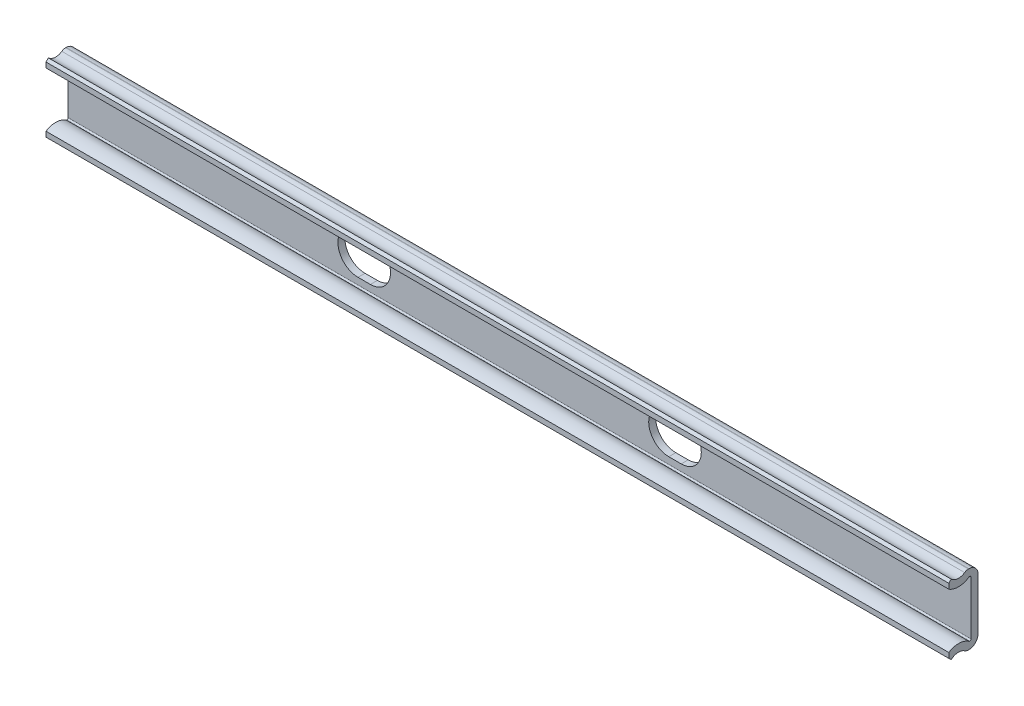
ISO-10303-21;
HEADER;
FILE_DESCRIPTION(('STEP AP214'),'2;1');
FILE_NAME('part.step','',(''),(''),'','','');
FILE_SCHEMA(('AUTOMOTIVE_DESIGN { 1 0 10303 214 1 1 1 1 }'));
ENDSEC;
DATA;
#1=APPLICATION_CONTEXT('core data for automotive mechanical design processes');
#2=APPLICATION_PROTOCOL_DEFINITION('international standard','automotive_design',2000,#1);
#3=PRODUCT_CONTEXT('',#1,'mechanical');
#4=PRODUCT('Part','Part','',(#3));
#5=PRODUCT_RELATED_PRODUCT_CATEGORY('part','',(#4));
#6=PRODUCT_DEFINITION_FORMATION('','',#4);
#7=PRODUCT_DEFINITION_CONTEXT('part definition',#1,'design');
#8=PRODUCT_DEFINITION('design','',#6,#7);
#9=PRODUCT_DEFINITION_SHAPE('','',#8);
#10=(LENGTH_UNIT() NAMED_UNIT(*) SI_UNIT(.MILLI.,.METRE.));
#11=(NAMED_UNIT(*) PLANE_ANGLE_UNIT() SI_UNIT($,.RADIAN.));
#12=(NAMED_UNIT(*) SI_UNIT($,.STERADIAN.) SOLID_ANGLE_UNIT());
#13=UNCERTAINTY_MEASURE_WITH_UNIT(LENGTH_MEASURE(1.E-05),#10,'distance_accuracy_value','');
#14=(GEOMETRIC_REPRESENTATION_CONTEXT(3) GLOBAL_UNCERTAINTY_ASSIGNED_CONTEXT((#13)) GLOBAL_UNIT_ASSIGNED_CONTEXT((#10,
#11,#12)) REPRESENTATION_CONTEXT('',''));
#15=CARTESIAN_POINT('',(0.,0.,0.));
#16=DIRECTION('',(0.,0.,1.));
#17=DIRECTION('',(1.,0.,0.));
#18=AXIS2_PLACEMENT_3D('',#15,#16,#17);
#19=CARTESIAN_POINT('',(200.,-6.06775074399303,-3.08));
#20=DIRECTION('',(0.,0.,-1.));
#21=DIRECTION('',(-1.,0.,0.));
#22=AXIS2_PLACEMENT_3D('',#19,#20,#21);
#23=PLANE('',#22);
#24=DIRECTION('',(0.,-1.,0.));
#25=VECTOR('',#24,1.);
#26=CARTESIAN_POINT('',(0.,-6.06775074399303,-3.08));
#27=LINE('',#26,#25);
#28=CARTESIAN_POINT('',(0.,-6.06775074399303,-3.08));
#29=VERTEX_POINT('',#28);
#30=CARTESIAN_POINT('',(0.,-7.21,-3.08));
#31=VERTEX_POINT('',#30);
#32=EDGE_CURVE('E266',#29,#31,#27,.T.);
#33=ORIENTED_EDGE('',*,*,#32,.T.);
#34=DIRECTION('',(-1.,0.,0.));
#35=VECTOR('',#34,1.);
#36=CARTESIAN_POINT('',(200.,-7.21,-3.08));
#37=LINE('',#36,#35);
#38=CARTESIAN_POINT('',(200.,-7.21,-3.08));
#39=VERTEX_POINT('',#38);
#40=EDGE_CURVE('E11',#39,#31,#37,.T.);
#41=ORIENTED_EDGE('',*,*,#40,.F.);
#42=DIRECTION('',(0.,-1.,0.));
#43=VECTOR('',#42,1.);
#44=CARTESIAN_POINT('',(200.,-6.06775074399303,-3.08));
#45=LINE('',#44,#43);
#46=CARTESIAN_POINT('',(200.,-6.06775074399303,-3.08));
#47=VERTEX_POINT('',#46);
#48=EDGE_CURVE('E267',#47,#39,#45,.T.);
#49=ORIENTED_EDGE('',*,*,#48,.F.);
#50=DIRECTION('',(-1.,0.,0.));
#51=VECTOR('',#50,1.);
#52=CARTESIAN_POINT('',(200.,-6.06775074399303,-3.08));
#53=LINE('',#52,#51);
#54=EDGE_CURVE('E313',#47,#29,#53,.T.);
#55=ORIENTED_EDGE('',*,*,#54,.T.);
#56=EDGE_LOOP('',(#33,#41,#49,#55));
#57=FACE_BOUND('',#56,.T.);
#58=ADVANCED_FACE('F17',(#57),#23,.F.);
#59=CARTESIAN_POINT('',(200.,-7.21,-3.08));
#60=DIRECTION('',(0.,0.70710678118655,-0.707106781186545));
#61=DIRECTION('',(0.,0.707106781186545,0.70710678118655));
#62=AXIS2_PLACEMENT_3D('',#59,#60,#61);
#63=PLANE('',#62);
#64=DIRECTION('',(0.,-0.707106781186545,-0.70710678118655));
#65=VECTOR('',#64,1.);
#66=CARTESIAN_POINT('',(0.,-7.21,-3.08));
#67=LINE('',#66,#65);
#68=CARTESIAN_POINT('',(0.,-7.73782878398184,-3.60782878398185));
#69=VERTEX_POINT('',#68);
#70=EDGE_CURVE('E316',#31,#69,#67,.T.);
#71=ORIENTED_EDGE('',*,*,#70,.T.);
#72=DIRECTION('',(-1.,0.,0.));
#73=VECTOR('',#72,1.);
#74=CARTESIAN_POINT('',(200.,-7.73782878398184,-3.60782878398185));
#75=LINE('',#74,#73);
#76=CARTESIAN_POINT('',(200.,-7.73782878398184,-3.60782878398185));
#77=VERTEX_POINT('',#76);
#78=EDGE_CURVE('E24',#77,#69,#75,.T.);
#79=ORIENTED_EDGE('',*,*,#78,.F.);
#80=DIRECTION('',(0.,-0.707106781186545,-0.70710678118655));
#81=VECTOR('',#80,1.);
#82=CARTESIAN_POINT('',(200.,-7.21,-3.08));
#83=LINE('',#82,#81);
#84=EDGE_CURVE('E270',#39,#77,#83,.T.);
#85=ORIENTED_EDGE('',*,*,#84,.F.);
#86=ORIENTED_EDGE('',*,*,#40,.T.);
#87=EDGE_LOOP('',(#71,#79,#85,#86));
#88=FACE_BOUND('',#87,.T.);
#89=ADVANCED_FACE('F412',(#88),#63,.F.);
#90=CARTESIAN_POINT('',(200.,-9.47,-5.24));
#91=DIRECTION('',(-1.,0.,0.));
#92=DIRECTION('',(0.,0.,1.));
#93=AXIS2_PLACEMENT_3D('',#90,#91,#92);
#94=CYLINDRICAL_SURFACE('',#93,2.38);
#95=CARTESIAN_POINT('',(0.,-9.47,-5.24));
#96=DIRECTION('',(1.,0.,0.));
#97=DIRECTION('',(0.,0.,-1.));
#98=AXIS2_PLACEMENT_3D('',#95,#96,#97);
#99=CIRCLE('',#98,2.38);
#100=CARTESIAN_POINT('',(0.,-7.50711340206186,-6.58591091965063));
#101=VERTEX_POINT('',#100);
#102=EDGE_CURVE('E319',#101,#69,#99,.T.);
#103=ORIENTED_EDGE('',*,*,#102,.F.);
#104=DIRECTION('',(-1.,0.,0.));
#105=VECTOR('',#104,1.);
#106=CARTESIAN_POINT('',(200.,-7.50711340206186,-6.58591091965063));
#107=LINE('',#106,#105);
#108=CARTESIAN_POINT('',(200.,-7.50711340206186,-6.58591091965063));
#109=VERTEX_POINT('',#108);
#110=EDGE_CURVE('E405',#109,#101,#107,.T.);
#111=ORIENTED_EDGE('',*,*,#110,.F.);
#112=CARTESIAN_POINT('',(200.,-9.47,-5.24));
#113=DIRECTION('',(1.,0.,0.));
#114=DIRECTION('',(0.,0.,-1.));
#115=AXIS2_PLACEMENT_3D('',#112,#113,#114);
#116=CIRCLE('',#115,2.38);
#117=EDGE_CURVE('E273',#109,#77,#116,.T.);
#118=ORIENTED_EDGE('',*,*,#117,.T.);
#119=ORIENTED_EDGE('',*,*,#78,.T.);
#120=EDGE_LOOP('',(#103,#111,#118,#119));
#121=FACE_BOUND('',#120,.T.);
#122=ADVANCED_FACE('F409',(#121),#94,.F.);
#123=CARTESIAN_POINT('',(200.,-6.26999999999999,-7.4341741043044));
#124=DIRECTION('',(-1.,0.,0.));
#125=DIRECTION('',(0.,0.,1.));
#126=AXIS2_PLACEMENT_3D('',#123,#124,#125);
#127=CYLINDRICAL_SURFACE('',#126,1.50000000000001);
#128=CARTESIAN_POINT('',(0.,-6.26999999999999,-7.4341741043044));
#129=DIRECTION('',(1.,0.,0.));
#130=DIRECTION('',(0.,0.,-1.));
#131=AXIS2_PLACEMENT_3D('',#128,#129,#130);
#132=CIRCLE('',#131,1.50000000000001);
#133=CARTESIAN_POINT('',(0.,-7.77,-7.4341741043044));
#134=VERTEX_POINT('',#133);
#135=EDGE_CURVE('E322',#101,#134,#132,.T.);
#136=ORIENTED_EDGE('',*,*,#135,.T.);
#137=DIRECTION('',(-1.,0.,0.));
#138=VECTOR('',#137,1.);
#139=CARTESIAN_POINT('',(200.,-7.77,-7.4341741043044));
#140=LINE('',#139,#138);
#141=CARTESIAN_POINT('',(200.,-7.77,-7.4341741043044));
#142=VERTEX_POINT('',#141);
#143=EDGE_CURVE('E402',#142,#134,#140,.T.);
#144=ORIENTED_EDGE('',*,*,#143,.F.);
#145=CARTESIAN_POINT('',(200.,-6.26999999999999,-7.4341741043044));
#146=DIRECTION('',(1.,0.,0.));
#147=DIRECTION('',(0.,0.,-1.));
#148=AXIS2_PLACEMENT_3D('',#145,#146,#147);
#149=CIRCLE('',#148,1.50000000000001);
#150=EDGE_CURVE('E276',#109,#142,#149,.T.);
#151=ORIENTED_EDGE('',*,*,#150,.F.);
#152=ORIENTED_EDGE('',*,*,#110,.T.);
#153=EDGE_LOOP('',(#136,#144,#151,#152));
#154=FACE_BOUND('',#153,.T.);
#155=ADVANCED_FACE('F422',(#154),#127,.T.);
#156=CARTESIAN_POINT('',(200.,-7.77,-7.43417410430439));
#157=DIRECTION('',(0.,1.,0.));
#158=DIRECTION('',(0.,0.,1.));
#159=AXIS2_PLACEMENT_3D('',#156,#157,#158);
#160=PLANE('',#159);
#161=DIRECTION('',(0.,0.,-1.));
#162=VECTOR('',#161,1.);
#163=CARTESIAN_POINT('',(0.,-7.77,-7.43417410430439));
#164=LINE('',#163,#162);
#165=CARTESIAN_POINT('',(0.,-7.77,-7.55));
#166=VERTEX_POINT('',#165);
#167=EDGE_CURVE('E324',#134,#166,#164,.T.);
#168=ORIENTED_EDGE('',*,*,#167,.T.);
#169=DIRECTION('',(-1.,0.,0.));
#170=VECTOR('',#169,1.);
#171=CARTESIAN_POINT('',(200.,-7.77,-7.55));
#172=LINE('',#171,#170);
#173=CARTESIAN_POINT('',(200.,-7.77,-7.55));
#174=VERTEX_POINT('',#173);
#175=EDGE_CURVE('E399',#174,#166,#172,.T.);
#176=ORIENTED_EDGE('',*,*,#175,.F.);
#177=DIRECTION('',(0.,0.,-1.));
#178=VECTOR('',#177,1.);
#179=CARTESIAN_POINT('',(200.,-7.77,-7.43417410430439));
#180=LINE('',#179,#178);
#181=EDGE_CURVE('E278',#142,#174,#180,.T.);
#182=ORIENTED_EDGE('',*,*,#181,.F.);
#183=ORIENTED_EDGE('',*,*,#143,.T.);
#184=EDGE_LOOP('',(#168,#176,#182,#183));
#185=FACE_BOUND('',#184,.T.);
#186=ADVANCED_FACE('F426',(#185),#160,.F.);
#187=CARTESIAN_POINT('',(200.,-5.77,-7.55));
#188=DIRECTION('',(-1.,0.,0.));
#189=DIRECTION('',(0.,0.,1.));
#190=AXIS2_PLACEMENT_3D('',#187,#188,#189);
#191=CYLINDRICAL_SURFACE('',#190,2.);
#192=CARTESIAN_POINT('',(0.,-5.77,-7.55));
#193=DIRECTION('',(1.,0.,0.));
#194=DIRECTION('',(0.,0.,-1.));
#195=AXIS2_PLACEMENT_3D('',#192,#193,#194);
#196=CIRCLE('',#195,2.);
#197=CARTESIAN_POINT('',(0.,-5.77,-9.55));
#198=VERTEX_POINT('',#197);
#199=EDGE_CURVE('E326',#166,#198,#196,.T.);
#200=ORIENTED_EDGE('',*,*,#199,.T.);
#201=DIRECTION('',(-1.,0.,0.));
#202=VECTOR('',#201,1.);
#203=CARTESIAN_POINT('',(200.,-5.77,-9.55));
#204=LINE('',#203,#202);
#205=CARTESIAN_POINT('',(200.,-5.77,-9.55));
#206=VERTEX_POINT('',#205);
#207=EDGE_CURVE('E396',#206,#198,#204,.T.);
#208=ORIENTED_EDGE('',*,*,#207,.F.);
#209=CARTESIAN_POINT('',(200.,-5.77,-7.55));
#210=DIRECTION('',(1.,0.,0.));
#211=DIRECTION('',(0.,0.,-1.));
#212=AXIS2_PLACEMENT_3D('',#209,#210,#211);
#213=CIRCLE('',#212,2.);
#214=EDGE_CURVE('E280',#174,#206,#213,.T.);
#215=ORIENTED_EDGE('',*,*,#214,.F.);
#216=ORIENTED_EDGE('',*,*,#175,.T.);
#217=EDGE_LOOP('',(#200,#208,#215,#216));
#218=FACE_BOUND('',#217,.T.);
#219=ADVANCED_FACE('F501',(#218),#191,.T.);
#220=CARTESIAN_POINT('',(200.,-5.77,-9.55));
#221=DIRECTION('',(0.,0.,1.));
#222=DIRECTION('',(1.,0.,0.));
#223=AXIS2_PLACEMENT_3D('',#220,#221,#222);
#224=PLANE('',#223);
#225=DIRECTION('',(1.,0.,0.));
#226=VECTOR('',#225,1.);
#227=CARTESIAN_POINT('',(200.,4.45,-9.55));
#228=LINE('',#227,#226);
#229=CARTESIAN_POINT('',(133.05,4.45,-9.55));
#230=VERTEX_POINT('',#229);
#231=CARTESIAN_POINT('',(135.8,4.45,-9.55));
#232=VERTEX_POINT('',#231);
#233=EDGE_CURVE('E235',#230,#232,#228,.T.);
#234=ORIENTED_EDGE('',*,*,#233,.F.);
#235=CARTESIAN_POINT('',(133.05,0.,-9.55));
#236=DIRECTION('',(0.,0.,1.));
#237=DIRECTION('',(1.,0.,0.));
#238=AXIS2_PLACEMENT_3D('',#235,#236,#237);
#239=CIRCLE('',#238,4.45);
#240=CARTESIAN_POINT('',(133.05,-4.45,-9.55));
#241=VERTEX_POINT('',#240);
#242=EDGE_CURVE('E215',#241,#230,#239,.F.);
#243=ORIENTED_EDGE('',*,*,#242,.F.);
#244=DIRECTION('',(-1.,0.,0.));
#245=VECTOR('',#244,1.);
#246=CARTESIAN_POINT('',(200.,-4.45,-9.55));
#247=LINE('',#246,#245);
#248=CARTESIAN_POINT('',(135.8,-4.45,-9.55));
#249=VERTEX_POINT('',#248);
#250=EDGE_CURVE('E232',#249,#241,#247,.T.);
#251=ORIENTED_EDGE('',*,*,#250,.F.);
#252=CARTESIAN_POINT('',(135.8,0.,-9.55));
#253=DIRECTION('',(0.,0.,1.));
#254=DIRECTION('',(1.,0.,0.));
#255=AXIS2_PLACEMENT_3D('',#252,#253,#254);
#256=CIRCLE('',#255,4.45);
#257=EDGE_CURVE('E216',#232,#249,#256,.F.);
#258=ORIENTED_EDGE('',*,*,#257,.F.);
#259=EDGE_LOOP('',(#234,#243,#251,#258));
#260=FACE_BOUND('',#259,.T.);
#261=DIRECTION('',(1.,0.,0.));
#262=VECTOR('',#261,1.);
#263=CARTESIAN_POINT('',(200.,4.45,-9.55));
#264=LINE('',#263,#262);
#265=CARTESIAN_POINT('',(64.2,4.45,-9.55));
#266=VERTEX_POINT('',#265);
#267=CARTESIAN_POINT('',(66.95,4.45,-9.55));
#268=VERTEX_POINT('',#267);
#269=EDGE_CURVE('E263',#266,#268,#264,.T.);
#270=ORIENTED_EDGE('',*,*,#269,.F.);
#271=CARTESIAN_POINT('',(64.2,0.,-9.55));
#272=DIRECTION('',(0.,0.,1.));
#273=DIRECTION('',(1.,0.,0.));
#274=AXIS2_PLACEMENT_3D('',#271,#272,#273);
#275=CIRCLE('',#274,4.45);
#276=CARTESIAN_POINT('',(64.2,-4.45,-9.55));
#277=VERTEX_POINT('',#276);
#278=EDGE_CURVE('E261',#277,#266,#275,.F.);
#279=ORIENTED_EDGE('',*,*,#278,.F.);
#280=DIRECTION('',(-1.,0.,0.));
#281=VECTOR('',#280,1.);
#282=CARTESIAN_POINT('',(200.,-4.45,-9.55));
#283=LINE('',#282,#281);
#284=CARTESIAN_POINT('',(66.95,-4.45,-9.55));
#285=VERTEX_POINT('',#284);
#286=EDGE_CURVE('E259',#285,#277,#283,.T.);
#287=ORIENTED_EDGE('',*,*,#286,.F.);
#288=CARTESIAN_POINT('',(66.95,0.,-9.55));
#289=DIRECTION('',(0.,0.,1.));
#290=DIRECTION('',(1.,0.,0.));
#291=AXIS2_PLACEMENT_3D('',#288,#289,#290);
#292=CIRCLE('',#291,4.45);
#293=EDGE_CURVE('E257',#268,#285,#292,.F.);
#294=ORIENTED_EDGE('',*,*,#293,.F.);
#295=EDGE_LOOP('',(#270,#279,#287,#294));
#296=FACE_BOUND('',#295,.T.);
#297=DIRECTION('',(0.,1.,0.));
#298=VECTOR('',#297,1.);
#299=CARTESIAN_POINT('',(0.,-5.77,-9.55));
#300=LINE('',#299,#298);
#301=CARTESIAN_POINT('',(0.,5.77,-9.55));
#302=VERTEX_POINT('',#301);
#303=EDGE_CURVE('E328',#198,#302,#300,.T.);
#304=ORIENTED_EDGE('',*,*,#303,.T.);
#305=DIRECTION('',(-1.,0.,0.));
#306=VECTOR('',#305,1.);
#307=CARTESIAN_POINT('',(200.,5.77,-9.55));
#308=LINE('',#307,#306);
#309=CARTESIAN_POINT('',(200.,5.77,-9.55));
#310=VERTEX_POINT('',#309);
#311=EDGE_CURVE('E393',#310,#302,#308,.T.);
#312=ORIENTED_EDGE('',*,*,#311,.F.);
#313=DIRECTION('',(0.,1.,0.));
#314=VECTOR('',#313,1.);
#315=CARTESIAN_POINT('',(200.,-5.77,-9.55));
#316=LINE('',#315,#314);
#317=EDGE_CURVE('E282',#206,#310,#316,.T.);
#318=ORIENTED_EDGE('',*,*,#317,.F.);
#319=ORIENTED_EDGE('',*,*,#207,.T.);
#320=EDGE_LOOP('',(#304,#312,#318,#319));
#321=FACE_BOUND('',#320,.T.);
#322=ADVANCED_FACE('F499',(#260,#296,#321),#224,.F.);
#323=CARTESIAN_POINT('',(200.,5.77,-7.55));
#324=DIRECTION('',(-1.,0.,0.));
#325=DIRECTION('',(0.,0.,1.));
#326=AXIS2_PLACEMENT_3D('',#323,#324,#325);
#327=CYLINDRICAL_SURFACE('',#326,2.);
#328=CARTESIAN_POINT('',(0.,5.77,-7.55));
#329=DIRECTION('',(1.,0.,0.));
#330=DIRECTION('',(0.,0.,-1.));
#331=AXIS2_PLACEMENT_3D('',#328,#329,#330);
#332=CIRCLE('',#331,2.);
#333=CARTESIAN_POINT('',(0.,7.77,-7.55));
#334=VERTEX_POINT('',#333);
#335=EDGE_CURVE('E330',#302,#334,#332,.T.);
#336=ORIENTED_EDGE('',*,*,#335,.T.);
#337=DIRECTION('',(-1.,0.,0.));
#338=VECTOR('',#337,1.);
#339=CARTESIAN_POINT('',(200.,7.77,-7.55));
#340=LINE('',#339,#338);
#341=CARTESIAN_POINT('',(200.,7.77,-7.55));
#342=VERTEX_POINT('',#341);
#343=EDGE_CURVE('E390',#342,#334,#340,.T.);
#344=ORIENTED_EDGE('',*,*,#343,.F.);
#345=CARTESIAN_POINT('',(200.,5.77,-7.55));
#346=DIRECTION('',(1.,0.,0.));
#347=DIRECTION('',(0.,0.,-1.));
#348=AXIS2_PLACEMENT_3D('',#345,#346,#347);
#349=CIRCLE('',#348,2.);
#350=EDGE_CURVE('E284',#310,#342,#349,.T.);
#351=ORIENTED_EDGE('',*,*,#350,.F.);
#352=ORIENTED_EDGE('',*,*,#311,.T.);
#353=EDGE_LOOP('',(#336,#344,#351,#352));
#354=FACE_BOUND('',#353,.T.);
#355=ADVANCED_FACE('F495',(#354),#327,.T.);
#356=CARTESIAN_POINT('',(200.,7.77,-7.55));
#357=DIRECTION('',(0.,-1.,0.));
#358=DIRECTION('',(0.,0.,-1.));
#359=AXIS2_PLACEMENT_3D('',#356,#357,#358);
#360=PLANE('',#359);
#361=DIRECTION('',(0.,0.,1.));
#362=VECTOR('',#361,1.);
#363=CARTESIAN_POINT('',(0.,7.77,-7.55));
#364=LINE('',#363,#362);
#365=CARTESIAN_POINT('',(0.,7.77,-7.43417410430439));
#366=VERTEX_POINT('',#365);
#367=EDGE_CURVE('E332',#334,#366,#364,.T.);
#368=ORIENTED_EDGE('',*,*,#367,.T.);
#369=DIRECTION('',(-1.,0.,0.));
#370=VECTOR('',#369,1.);
#371=CARTESIAN_POINT('',(200.,7.77,-7.43417410430439));
#372=LINE('',#371,#370);
#373=CARTESIAN_POINT('',(200.,7.77,-7.43417410430439));
#374=VERTEX_POINT('',#373);
#375=EDGE_CURVE('E387',#374,#366,#372,.T.);
#376=ORIENTED_EDGE('',*,*,#375,.F.);
#377=DIRECTION('',(0.,0.,1.));
#378=VECTOR('',#377,1.);
#379=CARTESIAN_POINT('',(200.,7.77,-7.55));
#380=LINE('',#379,#378);
#381=EDGE_CURVE('E286',#342,#374,#380,.T.);
#382=ORIENTED_EDGE('',*,*,#381,.F.);
#383=ORIENTED_EDGE('',*,*,#343,.T.);
#384=EDGE_LOOP('',(#368,#376,#382,#383));
#385=FACE_BOUND('',#384,.T.);
#386=ADVANCED_FACE('F490',(#385),#360,.F.);
#387=CARTESIAN_POINT('',(200.,6.26999999999998,-7.4341741043044));
#388=DIRECTION('',(-1.,0.,0.));
#389=DIRECTION('',(0.,0.,1.));
#390=AXIS2_PLACEMENT_3D('',#387,#388,#389);
#391=CYLINDRICAL_SURFACE('',#390,1.50000000000002);
#392=CARTESIAN_POINT('',(0.,6.26999999999998,-7.4341741043044));
#393=DIRECTION('',(1.,0.,0.));
#394=DIRECTION('',(0.,0.,-1.));
#395=AXIS2_PLACEMENT_3D('',#392,#393,#394);
#396=CIRCLE('',#395,1.50000000000002);
#397=CARTESIAN_POINT('',(0.,7.50711340206186,-6.58591091965063));
#398=VERTEX_POINT('',#397);
#399=EDGE_CURVE('E334',#366,#398,#396,.T.);
#400=ORIENTED_EDGE('',*,*,#399,.T.);
#401=DIRECTION('',(-1.,0.,0.));
#402=VECTOR('',#401,1.);
#403=CARTESIAN_POINT('',(200.,7.50711340206186,-6.58591091965063));
#404=LINE('',#403,#402);
#405=CARTESIAN_POINT('',(200.,7.50711340206186,-6.58591091965063));
#406=VERTEX_POINT('',#405);
#407=EDGE_CURVE('E385',#406,#398,#404,.T.);
#408=ORIENTED_EDGE('',*,*,#407,.F.);
#409=CARTESIAN_POINT('',(200.,6.26999999999998,-7.4341741043044));
#410=DIRECTION('',(1.,0.,0.));
#411=DIRECTION('',(0.,0.,-1.));
#412=AXIS2_PLACEMENT_3D('',#409,#410,#411);
#413=CIRCLE('',#412,1.50000000000002);
#414=EDGE_CURVE('E288',#374,#406,#413,.T.);
#415=ORIENTED_EDGE('',*,*,#414,.F.);
#416=ORIENTED_EDGE('',*,*,#375,.T.);
#417=EDGE_LOOP('',(#400,#408,#415,#416));
#418=FACE_BOUND('',#417,.T.);
#419=ADVANCED_FACE('F484',(#418),#391,.T.);
#420=CARTESIAN_POINT('',(200.,9.46999999999999,-5.24));
#421=DIRECTION('',(-1.,0.,0.));
#422=DIRECTION('',(0.,0.,1.));
#423=AXIS2_PLACEMENT_3D('',#420,#421,#422);
#424=CYLINDRICAL_SURFACE('',#423,2.37999999999999);
#425=CARTESIAN_POINT('',(0.,9.46999999999999,-5.24));
#426=DIRECTION('',(1.,0.,0.));
#427=DIRECTION('',(0.,0.,-1.));
#428=AXIS2_PLACEMENT_3D('',#425,#426,#427);
#429=CIRCLE('',#428,2.37999999999999);
#430=CARTESIAN_POINT('',(0.,7.73782878398184,-3.60782878398185));
#431=VERTEX_POINT('',#430);
#432=EDGE_CURVE('E337',#431,#398,#429,.T.);
#433=ORIENTED_EDGE('',*,*,#432,.F.);
#434=DIRECTION('',(-1.,0.,0.));
#435=VECTOR('',#434,1.);
#436=CARTESIAN_POINT('',(200.,7.73782878398184,-3.60782878398185));
#437=LINE('',#436,#435);
#438=CARTESIAN_POINT('',(200.,7.73782878398184,-3.60782878398185));
#439=VERTEX_POINT('',#438);
#440=EDGE_CURVE('E383',#439,#431,#437,.T.);
#441=ORIENTED_EDGE('',*,*,#440,.F.);
#442=CARTESIAN_POINT('',(200.,9.46999999999999,-5.24));
#443=DIRECTION('',(1.,0.,0.));
#444=DIRECTION('',(0.,0.,-1.));
#445=AXIS2_PLACEMENT_3D('',#442,#443,#444);
#446=CIRCLE('',#445,2.37999999999999);
#447=EDGE_CURVE('E290',#439,#406,#446,.T.);
#448=ORIENTED_EDGE('',*,*,#447,.T.);
#449=ORIENTED_EDGE('',*,*,#407,.T.);
#450=EDGE_LOOP('',(#433,#441,#448,#449));
#451=FACE_BOUND('',#450,.T.);
#452=ADVANCED_FACE('F480',(#451),#424,.F.);
#453=CARTESIAN_POINT('',(200.,7.73782878398184,-3.60782878398185));
#454=DIRECTION('',(0.,-0.707106781186548,-0.707106781186547));
#455=DIRECTION('',(0.,0.707106781186547,-0.707106781186548));
#456=AXIS2_PLACEMENT_3D('',#453,#454,#455);
#457=PLANE('',#456);
#458=DIRECTION('',(0.,-0.707106781186547,0.707106781186548));
#459=VECTOR('',#458,1.);
#460=CARTESIAN_POINT('',(0.,7.73782878398184,-3.60782878398185));
#461=LINE('',#460,#459);
#462=CARTESIAN_POINT('',(0.,7.21,-3.08));
#463=VERTEX_POINT('',#462);
#464=EDGE_CURVE('E340',#431,#463,#461,.T.);
#465=ORIENTED_EDGE('',*,*,#464,.T.);
#466=DIRECTION('',(-1.,0.,0.));
#467=VECTOR('',#466,1.);
#468=CARTESIAN_POINT('',(200.,7.21,-3.08));
#469=LINE('',#468,#467);
#470=CARTESIAN_POINT('',(200.,7.21,-3.08));
#471=VERTEX_POINT('',#470);
#472=EDGE_CURVE('E380',#471,#463,#469,.T.);
#473=ORIENTED_EDGE('',*,*,#472,.F.);
#474=DIRECTION('',(0.,-0.707106781186547,0.707106781186548));
#475=VECTOR('',#474,1.);
#476=CARTESIAN_POINT('',(200.,7.73782878398184,-3.60782878398185));
#477=LINE('',#476,#475);
#478=EDGE_CURVE('E293',#439,#471,#477,.T.);
#479=ORIENTED_EDGE('',*,*,#478,.F.);
#480=ORIENTED_EDGE('',*,*,#440,.T.);
#481=EDGE_LOOP('',(#465,#473,#479,#480));
#482=FACE_BOUND('',#481,.T.);
#483=ADVANCED_FACE('F475',(#482),#457,.F.);
#484=CARTESIAN_POINT('',(200.,7.21,-3.08));
#485=DIRECTION('',(0.,0.,-1.));
#486=DIRECTION('',(-1.,0.,0.));
#487=AXIS2_PLACEMENT_3D('',#484,#485,#486);
#488=PLANE('',#487);
#489=DIRECTION('',(0.,-1.,0.));
#490=VECTOR('',#489,1.);
#491=CARTESIAN_POINT('',(0.,7.21,-3.08));
#492=LINE('',#491,#490);
#493=CARTESIAN_POINT('',(0.,6.06775074399303,-3.08));
#494=VERTEX_POINT('',#493);
#495=EDGE_CURVE('E342',#463,#494,#492,.T.);
#496=ORIENTED_EDGE('',*,*,#495,.T.);
#497=DIRECTION('',(-1.,0.,0.));
#498=VECTOR('',#497,1.);
#499=CARTESIAN_POINT('',(200.,6.06775074399303,-3.08));
#500=LINE('',#499,#498);
#501=CARTESIAN_POINT('',(200.,6.06775074399303,-3.08));
#502=VERTEX_POINT('',#501);
#503=EDGE_CURVE('E377',#502,#494,#500,.T.);
#504=ORIENTED_EDGE('',*,*,#503,.F.);
#505=DIRECTION('',(0.,-1.,0.));
#506=VECTOR('',#505,1.);
#507=CARTESIAN_POINT('',(200.,7.21,-3.08));
#508=LINE('',#507,#506);
#509=EDGE_CURVE('E295',#471,#502,#508,.T.);
#510=ORIENTED_EDGE('',*,*,#509,.F.);
#511=ORIENTED_EDGE('',*,*,#472,.T.);
#512=EDGE_LOOP('',(#496,#504,#510,#511));
#513=FACE_BOUND('',#512,.T.);
#514=ADVANCED_FACE('F471',(#513),#488,.F.);
#515=CARTESIAN_POINT('',(200.,9.47,-5.24));
#516=DIRECTION('',(-1.,0.,0.));
#517=DIRECTION('',(0.,0.,1.));
#518=AXIS2_PLACEMENT_3D('',#515,#516,#517);
#519=CYLINDRICAL_SURFACE('',#518,4.03);
#520=CARTESIAN_POINT('',(0.,9.47,-5.24));
#521=DIRECTION('',(1.,0.,0.));
#522=DIRECTION('',(0.,0.,-1.));
#523=AXIS2_PLACEMENT_3D('',#520,#521,#522);
#524=CIRCLE('',#523,4.03);
#525=CARTESIAN_POINT('',(0.,6.22,-7.62293936137703));
#526=VERTEX_POINT('',#525);
#527=EDGE_CURVE('E344',#494,#526,#524,.T.);
#528=ORIENTED_EDGE('',*,*,#527,.T.);
#529=DIRECTION('',(-1.,0.,0.));
#530=VECTOR('',#529,1.);
#531=CARTESIAN_POINT('',(200.,6.22,-7.62293936137703));
#532=LINE('',#531,#530);
#533=CARTESIAN_POINT('',(200.,6.22,-7.62293936137703));
#534=VERTEX_POINT('',#533);
#535=EDGE_CURVE('E374',#534,#526,#532,.T.);
#536=ORIENTED_EDGE('',*,*,#535,.F.);
#537=CARTESIAN_POINT('',(200.,9.47,-5.24));
#538=DIRECTION('',(1.,0.,0.));
#539=DIRECTION('',(0.,0.,-1.));
#540=AXIS2_PLACEMENT_3D('',#537,#538,#539);
#541=CIRCLE('',#540,4.03);
#542=EDGE_CURVE('E297',#502,#534,#541,.T.);
#543=ORIENTED_EDGE('',*,*,#542,.F.);
#544=ORIENTED_EDGE('',*,*,#503,.T.);
#545=EDGE_LOOP('',(#528,#536,#543,#544));
#546=FACE_BOUND('',#545,.T.);
#547=ADVANCED_FACE('F466',(#546),#519,.T.);
#548=CARTESIAN_POINT('',(200.,6.22,-7.62293936137704));
#549=DIRECTION('',(0.,1.,0.));
#550=DIRECTION('',(0.,0.,1.));
#551=AXIS2_PLACEMENT_3D('',#548,#549,#550);
#552=PLANE('',#551);
#553=DIRECTION('',(0.,0.,-1.));
#554=VECTOR('',#553,1.);
#555=CARTESIAN_POINT('',(0.,6.22,-7.62293936137704));
#556=LINE('',#555,#554);
#557=CARTESIAN_POINT('',(0.,6.22,-7.7));
#558=VERTEX_POINT('',#557);
#559=EDGE_CURVE('E346',#526,#558,#556,.T.);
#560=ORIENTED_EDGE('',*,*,#559,.T.);
#561=DIRECTION('',(-1.,0.,0.));
#562=VECTOR('',#561,1.);
#563=CARTESIAN_POINT('',(200.,6.22,-7.7));
#564=LINE('',#563,#562);
#565=CARTESIAN_POINT('',(200.,6.22,-7.7));
#566=VERTEX_POINT('',#565);
#567=EDGE_CURVE('E372',#566,#558,#564,.T.);
#568=ORIENTED_EDGE('',*,*,#567,.F.);
#569=DIRECTION('',(0.,0.,-1.));
#570=VECTOR('',#569,1.);
#571=CARTESIAN_POINT('',(200.,6.22,-7.62293936137704));
#572=LINE('',#571,#570);
#573=EDGE_CURVE('E299',#534,#566,#572,.T.);
#574=ORIENTED_EDGE('',*,*,#573,.F.);
#575=ORIENTED_EDGE('',*,*,#535,.T.);
#576=EDGE_LOOP('',(#560,#568,#574,#575));
#577=FACE_BOUND('',#576,.T.);
#578=ADVANCED_FACE('F460',(#577),#552,.F.);
#579=CARTESIAN_POINT('',(200.,5.92,-7.7));
#580=DIRECTION('',(-1.,0.,0.));
#581=DIRECTION('',(0.,0.,1.));
#582=AXIS2_PLACEMENT_3D('',#579,#580,#581);
#583=CYLINDRICAL_SURFACE('',#582,0.300000000000001);
#584=CARTESIAN_POINT('',(0.,5.92,-7.7));
#585=DIRECTION('',(1.,0.,0.));
#586=DIRECTION('',(0.,0.,-1.));
#587=AXIS2_PLACEMENT_3D('',#584,#585,#586);
#588=CIRCLE('',#587,0.300000000000001);
#589=CARTESIAN_POINT('',(0.,5.92,-8.));
#590=VERTEX_POINT('',#589);
#591=EDGE_CURVE('E349',#590,#558,#588,.T.);
#592=ORIENTED_EDGE('',*,*,#591,.F.);
#593=DIRECTION('',(-1.,0.,0.));
#594=VECTOR('',#593,1.);
#595=CARTESIAN_POINT('',(200.,5.92,-8.));
#596=LINE('',#595,#594);
#597=CARTESIAN_POINT('',(200.,5.92,-8.));
#598=VERTEX_POINT('',#597);
#599=EDGE_CURVE('E370',#598,#590,#596,.T.);
#600=ORIENTED_EDGE('',*,*,#599,.F.);
#601=CARTESIAN_POINT('',(200.,5.92,-7.7));
#602=DIRECTION('',(1.,0.,0.));
#603=DIRECTION('',(0.,0.,-1.));
#604=AXIS2_PLACEMENT_3D('',#601,#602,#603);
#605=CIRCLE('',#604,0.300000000000001);
#606=EDGE_CURVE('E301',#598,#566,#605,.T.);
#607=ORIENTED_EDGE('',*,*,#606,.T.);
#608=ORIENTED_EDGE('',*,*,#567,.T.);
#609=EDGE_LOOP('',(#592,#600,#607,#608));
#610=FACE_BOUND('',#609,.T.);
#611=ADVANCED_FACE('F454',(#610),#583,.F.);
#612=CARTESIAN_POINT('',(200.,5.92,-8.));
#613=DIRECTION('',(0.,0.,-1.));
#614=DIRECTION('',(-1.,0.,0.));
#615=AXIS2_PLACEMENT_3D('',#612,#613,#614);
#616=PLANE('',#615);
#617=DIRECTION('',(-1.,0.,0.));
#618=VECTOR('',#617,1.);
#619=CARTESIAN_POINT('',(135.8,4.45,-8.));
#620=LINE('',#619,#618);
#621=CARTESIAN_POINT('',(135.8,4.45,-8.));
#622=VERTEX_POINT('',#621);
#623=CARTESIAN_POINT('',(133.05,4.45,-8.));
#624=VERTEX_POINT('',#623);
#625=EDGE_CURVE('E200',#622,#624,#620,.T.);
#626=ORIENTED_EDGE('',*,*,#625,.F.);
#627=CARTESIAN_POINT('',(135.8,0.,-8.));
#628=DIRECTION('',(0.,0.,1.));
#629=DIRECTION('',(1.,0.,0.));
#630=AXIS2_PLACEMENT_3D('',#627,#628,#629);
#631=CIRCLE('',#630,4.45);
#632=CARTESIAN_POINT('',(135.8,-4.45,-8.));
#633=VERTEX_POINT('',#632);
#634=EDGE_CURVE('E224',#633,#622,#631,.T.);
#635=ORIENTED_EDGE('',*,*,#634,.F.);
#636=DIRECTION('',(1.,0.,0.));
#637=VECTOR('',#636,1.);
#638=CARTESIAN_POINT('',(133.05,-4.45,-8.));
#639=LINE('',#638,#637);
#640=CARTESIAN_POINT('',(133.05,-4.45,-8.));
#641=VERTEX_POINT('',#640);
#642=EDGE_CURVE('E222',#641,#633,#639,.T.);
#643=ORIENTED_EDGE('',*,*,#642,.F.);
#644=CARTESIAN_POINT('',(133.05,0.,-8.));
#645=DIRECTION('',(0.,0.,1.));
#646=DIRECTION('',(1.,0.,0.));
#647=AXIS2_PLACEMENT_3D('',#644,#645,#646);
#648=CIRCLE('',#647,4.45);
#649=EDGE_CURVE('E208',#624,#641,#648,.T.);
#650=ORIENTED_EDGE('',*,*,#649,.F.);
#651=EDGE_LOOP('',(#626,#635,#643,#650));
#652=FACE_BOUND('',#651,.T.);
#653=DIRECTION('',(-1.,0.,0.));
#654=VECTOR('',#653,1.);
#655=CARTESIAN_POINT('',(66.95,4.45,-8.));
#656=LINE('',#655,#654);
#657=CARTESIAN_POINT('',(66.95,4.45,-8.));
#658=VERTEX_POINT('',#657);
#659=CARTESIAN_POINT('',(64.2,4.45,-8.));
#660=VERTEX_POINT('',#659);
#661=EDGE_CURVE('E237',#658,#660,#656,.T.);
#662=ORIENTED_EDGE('',*,*,#661,.F.);
#663=CARTESIAN_POINT('',(66.95,0.,-8.));
#664=DIRECTION('',(0.,0.,1.));
#665=DIRECTION('',(1.,0.,0.));
#666=AXIS2_PLACEMENT_3D('',#663,#664,#665);
#667=CIRCLE('',#666,4.45);
#668=CARTESIAN_POINT('',(66.95,-4.45,-8.));
#669=VERTEX_POINT('',#668);
#670=EDGE_CURVE('E244',#669,#658,#667,.T.);
#671=ORIENTED_EDGE('',*,*,#670,.F.);
#672=DIRECTION('',(1.,0.,0.));
#673=VECTOR('',#672,1.);
#674=CARTESIAN_POINT('',(64.2,-4.45,-8.));
#675=LINE('',#674,#673);
#676=CARTESIAN_POINT('',(64.2,-4.45,-8.));
#677=VERTEX_POINT('',#676);
#678=EDGE_CURVE('E241',#677,#669,#675,.T.);
#679=ORIENTED_EDGE('',*,*,#678,.F.);
#680=CARTESIAN_POINT('',(64.2,0.,-8.));
#681=DIRECTION('',(0.,0.,1.));
#682=DIRECTION('',(1.,0.,0.));
#683=AXIS2_PLACEMENT_3D('',#680,#681,#682);
#684=CIRCLE('',#683,4.45);
#685=EDGE_CURVE('E239',#660,#677,#684,.T.);
#686=ORIENTED_EDGE('',*,*,#685,.F.);
#687=EDGE_LOOP('',(#662,#671,#679,#686));
#688=FACE_BOUND('',#687,.T.);
#689=DIRECTION('',(0.,-1.,0.));
#690=VECTOR('',#689,1.);
#691=CARTESIAN_POINT('',(0.,5.92,-8.));
#692=LINE('',#691,#690);
#693=CARTESIAN_POINT('',(0.,-5.92,-8.));
#694=VERTEX_POINT('',#693);
#695=EDGE_CURVE('E352',#590,#694,#692,.T.);
#696=ORIENTED_EDGE('',*,*,#695,.T.);
#697=DIRECTION('',(-1.,0.,0.));
#698=VECTOR('',#697,1.);
#699=CARTESIAN_POINT('',(200.,-5.92,-8.));
#700=LINE('',#699,#698);
#701=CARTESIAN_POINT('',(200.,-5.92,-8.));
#702=VERTEX_POINT('',#701);
#703=EDGE_CURVE('E368',#702,#694,#700,.T.);
#704=ORIENTED_EDGE('',*,*,#703,.F.);
#705=DIRECTION('',(0.,-1.,0.));
#706=VECTOR('',#705,1.);
#707=CARTESIAN_POINT('',(200.,5.92,-8.));
#708=LINE('',#707,#706);
#709=EDGE_CURVE('E304',#598,#702,#708,.T.);
#710=ORIENTED_EDGE('',*,*,#709,.F.);
#711=ORIENTED_EDGE('',*,*,#599,.T.);
#712=EDGE_LOOP('',(#696,#704,#710,#711));
#713=FACE_BOUND('',#712,.T.);
#714=ADVANCED_FACE('F220',(#652,#688,#713),#616,.F.);
#715=CARTESIAN_POINT('',(200.,-5.92,-7.7));
#716=DIRECTION('',(-1.,0.,0.));
#717=DIRECTION('',(0.,0.,1.));
#718=AXIS2_PLACEMENT_3D('',#715,#716,#717);
#719=CYLINDRICAL_SURFACE('',#718,0.300000000000002);
#720=CARTESIAN_POINT('',(0.,-5.92,-7.7));
#721=DIRECTION('',(1.,0.,0.));
#722=DIRECTION('',(0.,0.,-1.));
#723=AXIS2_PLACEMENT_3D('',#720,#721,#722);
#724=CIRCLE('',#723,0.300000000000002);
#725=CARTESIAN_POINT('',(0.,-6.22,-7.7));
#726=VERTEX_POINT('',#725);
#727=EDGE_CURVE('E355',#726,#694,#724,.T.);
#728=ORIENTED_EDGE('',*,*,#727,.F.);
#729=DIRECTION('',(-1.,0.,0.));
#730=VECTOR('',#729,1.);
#731=CARTESIAN_POINT('',(200.,-6.22,-7.7));
#732=LINE('',#731,#730);
#733=CARTESIAN_POINT('',(200.,-6.22,-7.7));
#734=VERTEX_POINT('',#733);
#735=EDGE_CURVE('E366',#734,#726,#732,.T.);
#736=ORIENTED_EDGE('',*,*,#735,.F.);
#737=CARTESIAN_POINT('',(200.,-5.92,-7.7));
#738=DIRECTION('',(1.,0.,0.));
#739=DIRECTION('',(0.,0.,-1.));
#740=AXIS2_PLACEMENT_3D('',#737,#738,#739);
#741=CIRCLE('',#740,0.300000000000002);
#742=EDGE_CURVE('E306',#734,#702,#741,.T.);
#743=ORIENTED_EDGE('',*,*,#742,.T.);
#744=ORIENTED_EDGE('',*,*,#703,.T.);
#745=EDGE_LOOP('',(#728,#736,#743,#744));
#746=FACE_BOUND('',#745,.T.);
#747=ADVANCED_FACE('F447',(#746),#719,.F.);
#748=CARTESIAN_POINT('',(200.,-6.22,-7.7));
#749=DIRECTION('',(0.,-1.,0.));
#750=DIRECTION('',(0.,0.,-1.));
#751=AXIS2_PLACEMENT_3D('',#748,#749,#750);
#752=PLANE('',#751);
#753=DIRECTION('',(0.,0.,1.));
#754=VECTOR('',#753,1.);
#755=CARTESIAN_POINT('',(0.,-6.22,-7.7));
#756=LINE('',#755,#754);
#757=CARTESIAN_POINT('',(0.,-6.22,-7.62293936137704));
#758=VERTEX_POINT('',#757);
#759=EDGE_CURVE('E358',#726,#758,#756,.T.);
#760=ORIENTED_EDGE('',*,*,#759,.T.);
#761=DIRECTION('',(-1.,0.,0.));
#762=VECTOR('',#761,1.);
#763=CARTESIAN_POINT('',(200.,-6.22,-7.62293936137704));
#764=LINE('',#763,#762);
#765=CARTESIAN_POINT('',(200.,-6.22,-7.62293936137704));
#766=VERTEX_POINT('',#765);
#767=EDGE_CURVE('E363',#766,#758,#764,.T.);
#768=ORIENTED_EDGE('',*,*,#767,.F.);
#769=DIRECTION('',(0.,0.,1.));
#770=VECTOR('',#769,1.);
#771=CARTESIAN_POINT('',(200.,-6.22,-7.7));
#772=LINE('',#771,#770);
#773=EDGE_CURVE('E309',#734,#766,#772,.T.);
#774=ORIENTED_EDGE('',*,*,#773,.F.);
#775=ORIENTED_EDGE('',*,*,#735,.T.);
#776=EDGE_LOOP('',(#760,#768,#774,#775));
#777=FACE_BOUND('',#776,.T.);
#778=ADVANCED_FACE('F444',(#777),#752,.F.);
#779=CARTESIAN_POINT('',(200.,-9.46999999999999,-5.24));
#780=DIRECTION('',(-1.,0.,0.));
#781=DIRECTION('',(0.,0.,1.));
#782=AXIS2_PLACEMENT_3D('',#779,#780,#781);
#783=CYLINDRICAL_SURFACE('',#782,4.02999999999999);
#784=CARTESIAN_POINT('',(0.,-9.46999999999999,-5.24));
#785=DIRECTION('',(1.,0.,0.));
#786=DIRECTION('',(0.,0.,-1.));
#787=AXIS2_PLACEMENT_3D('',#784,#785,#786);
#788=CIRCLE('',#787,4.02999999999999);
#789=EDGE_CURVE('E271',#758,#29,#788,.T.);
#790=ORIENTED_EDGE('',*,*,#789,.T.);
#791=ORIENTED_EDGE('',*,*,#54,.F.);
#792=CARTESIAN_POINT('',(200.,-9.46999999999999,-5.24));
#793=DIRECTION('',(1.,0.,0.));
#794=DIRECTION('',(0.,0.,-1.));
#795=AXIS2_PLACEMENT_3D('',#792,#793,#794);
#796=CIRCLE('',#795,4.02999999999999);
#797=EDGE_CURVE('E311',#766,#47,#796,.T.);
#798=ORIENTED_EDGE('',*,*,#797,.F.);
#799=ORIENTED_EDGE('',*,*,#767,.T.);
#800=EDGE_LOOP('',(#790,#791,#798,#799));
#801=FACE_BOUND('',#800,.T.);
#802=ADVANCED_FACE('F440',(#801),#783,.T.);
#803=CARTESIAN_POINT('',(200.,-9.47,-5.24));
#804=DIRECTION('',(1.,0.,0.));
#805=DIRECTION('',(0.,0.,-1.));
#806=AXIS2_PLACEMENT_3D('',#803,#804,#805);
#807=PLANE('',#806);
#808=ORIENTED_EDGE('',*,*,#48,.T.);
#809=ORIENTED_EDGE('',*,*,#84,.T.);
#810=ORIENTED_EDGE('',*,*,#117,.F.);
#811=ORIENTED_EDGE('',*,*,#150,.T.);
#812=ORIENTED_EDGE('',*,*,#181,.T.);
#813=ORIENTED_EDGE('',*,*,#214,.T.);
#814=ORIENTED_EDGE('',*,*,#317,.T.);
#815=ORIENTED_EDGE('',*,*,#350,.T.);
#816=ORIENTED_EDGE('',*,*,#381,.T.);
#817=ORIENTED_EDGE('',*,*,#414,.T.);
#818=ORIENTED_EDGE('',*,*,#447,.F.);
#819=ORIENTED_EDGE('',*,*,#478,.T.);
#820=ORIENTED_EDGE('',*,*,#509,.T.);
#821=ORIENTED_EDGE('',*,*,#542,.T.);
#822=ORIENTED_EDGE('',*,*,#573,.T.);
#823=ORIENTED_EDGE('',*,*,#606,.F.);
#824=ORIENTED_EDGE('',*,*,#709,.T.);
#825=ORIENTED_EDGE('',*,*,#742,.F.);
#826=ORIENTED_EDGE('',*,*,#773,.T.);
#827=ORIENTED_EDGE('',*,*,#797,.T.);
#828=EDGE_LOOP('',(#808,#809,#810,#811,#812,#813,#814,#815,#816,#817,#818,#819,#820,#821,#822,
#823,#824,#825,#826,#827));
#829=FACE_BOUND('',#828,.T.);
#830=ADVANCED_FACE('F430',(#829),#807,.T.);
#831=CARTESIAN_POINT('',(0.,-9.47,-5.24));
#832=DIRECTION('',(1.,0.,0.));
#833=DIRECTION('',(0.,0.,-1.));
#834=AXIS2_PLACEMENT_3D('',#831,#832,#833);
#835=PLANE('',#834);
#836=ORIENTED_EDGE('',*,*,#32,.F.);
#837=ORIENTED_EDGE('',*,*,#789,.F.);
#838=ORIENTED_EDGE('',*,*,#759,.F.);
#839=ORIENTED_EDGE('',*,*,#727,.T.);
#840=ORIENTED_EDGE('',*,*,#695,.F.);
#841=ORIENTED_EDGE('',*,*,#591,.T.);
#842=ORIENTED_EDGE('',*,*,#559,.F.);
#843=ORIENTED_EDGE('',*,*,#527,.F.);
#844=ORIENTED_EDGE('',*,*,#495,.F.);
#845=ORIENTED_EDGE('',*,*,#464,.F.);
#846=ORIENTED_EDGE('',*,*,#432,.T.);
#847=ORIENTED_EDGE('',*,*,#399,.F.);
#848=ORIENTED_EDGE('',*,*,#367,.F.);
#849=ORIENTED_EDGE('',*,*,#335,.F.);
#850=ORIENTED_EDGE('',*,*,#303,.F.);
#851=ORIENTED_EDGE('',*,*,#199,.F.);
#852=ORIENTED_EDGE('',*,*,#167,.F.);
#853=ORIENTED_EDGE('',*,*,#135,.F.);
#854=ORIENTED_EDGE('',*,*,#102,.T.);
#855=ORIENTED_EDGE('',*,*,#70,.F.);
#856=EDGE_LOOP('',(#836,#837,#838,#839,#840,#841,#842,#843,#844,#845,#846,#847,#848,#849,#850,
#851,#852,#853,#854,#855));
#857=FACE_BOUND('',#856,.T.);
#858=ADVANCED_FACE('F417',(#857),#835,.F.);
#859=CARTESIAN_POINT('',(66.95,4.45,-8.));
#860=DIRECTION('',(0.,-1.,0.));
#861=DIRECTION('',(0.,0.,-1.));
#862=AXIS2_PLACEMENT_3D('',#859,#860,#861);
#863=PLANE('',#862);
#864=ORIENTED_EDGE('',*,*,#269,.T.);
#865=DIRECTION('',(0.,0.,-1.));
#866=VECTOR('',#865,1.);
#867=CARTESIAN_POINT('',(66.95,4.45,-8.));
#868=LINE('',#867,#866);
#869=EDGE_CURVE('E246',#658,#268,#868,.T.);
#870=ORIENTED_EDGE('',*,*,#869,.F.);
#871=ORIENTED_EDGE('',*,*,#661,.T.);
#872=DIRECTION('',(0.,0.,-1.));
#873=VECTOR('',#872,1.);
#874=CARTESIAN_POINT('',(64.2,4.45,-8.));
#875=LINE('',#874,#873);
#876=EDGE_CURVE('E254',#660,#266,#875,.T.);
#877=ORIENTED_EDGE('',*,*,#876,.T.);
#878=EDGE_LOOP('',(#864,#870,#871,#877));
#879=FACE_BOUND('',#878,.T.);
#880=ADVANCED_FACE('F666',(#879),#863,.T.);
#881=CARTESIAN_POINT('',(64.2,0.,-8.));
#882=DIRECTION('',(0.,0.,-1.));
#883=DIRECTION('',(-1.,0.,0.));
#884=AXIS2_PLACEMENT_3D('',#881,#882,#883);
#885=CYLINDRICAL_SURFACE('',#884,4.45);
#886=ORIENTED_EDGE('',*,*,#278,.T.);
#887=ORIENTED_EDGE('',*,*,#876,.F.);
#888=ORIENTED_EDGE('',*,*,#685,.T.);
#889=DIRECTION('',(0.,0.,-1.));
#890=VECTOR('',#889,1.);
#891=CARTESIAN_POINT('',(64.2,-4.45,-8.));
#892=LINE('',#891,#890);
#893=EDGE_CURVE('E251',#677,#277,#892,.T.);
#894=ORIENTED_EDGE('',*,*,#893,.T.);
#895=EDGE_LOOP('',(#886,#887,#888,#894));
#896=FACE_BOUND('',#895,.T.);
#897=ADVANCED_FACE('F675',(#896),#885,.F.);
#898=CARTESIAN_POINT('',(64.2,-4.45,-8.));
#899=DIRECTION('',(0.,1.,0.));
#900=DIRECTION('',(0.,0.,1.));
#901=AXIS2_PLACEMENT_3D('',#898,#899,#900);
#902=PLANE('',#901);
#903=ORIENTED_EDGE('',*,*,#286,.T.);
#904=ORIENTED_EDGE('',*,*,#893,.F.);
#905=ORIENTED_EDGE('',*,*,#678,.T.);
#906=DIRECTION('',(0.,0.,-1.));
#907=VECTOR('',#906,1.);
#908=CARTESIAN_POINT('',(66.95,-4.45,-8.));
#909=LINE('',#908,#907);
#910=EDGE_CURVE('E248',#669,#285,#909,.T.);
#911=ORIENTED_EDGE('',*,*,#910,.T.);
#912=EDGE_LOOP('',(#903,#904,#905,#911));
#913=FACE_BOUND('',#912,.T.);
#914=ADVANCED_FACE('F685',(#913),#902,.T.);
#915=CARTESIAN_POINT('',(66.95,0.,-8.));
#916=DIRECTION('',(0.,0.,-1.));
#917=DIRECTION('',(-1.,0.,0.));
#918=AXIS2_PLACEMENT_3D('',#915,#916,#917);
#919=CYLINDRICAL_SURFACE('',#918,4.45);
#920=ORIENTED_EDGE('',*,*,#293,.T.);
#921=ORIENTED_EDGE('',*,*,#910,.F.);
#922=ORIENTED_EDGE('',*,*,#670,.T.);
#923=ORIENTED_EDGE('',*,*,#869,.T.);
#924=EDGE_LOOP('',(#920,#921,#922,#923));
#925=FACE_BOUND('',#924,.T.);
#926=ADVANCED_FACE('F695',(#925),#919,.F.);
#927=CARTESIAN_POINT('',(135.8,4.45,-8.));
#928=DIRECTION('',(0.,-1.,0.));
#929=DIRECTION('',(0.,0.,-1.));
#930=AXIS2_PLACEMENT_3D('',#927,#928,#929);
#931=PLANE('',#930);
#932=ORIENTED_EDGE('',*,*,#233,.T.);
#933=DIRECTION('',(0.,0.,-1.));
#934=VECTOR('',#933,1.);
#935=CARTESIAN_POINT('',(135.8,4.45,-8.));
#936=LINE('',#935,#934);
#937=EDGE_CURVE('E31',#622,#232,#936,.T.);
#938=ORIENTED_EDGE('',*,*,#937,.F.);
#939=ORIENTED_EDGE('',*,*,#625,.T.);
#940=DIRECTION('',(0.,0.,-1.));
#941=VECTOR('',#940,1.);
#942=CARTESIAN_POINT('',(133.05,4.45,-8.));
#943=LINE('',#942,#941);
#944=EDGE_CURVE('E203',#624,#230,#943,.T.);
#945=ORIENTED_EDGE('',*,*,#944,.T.);
#946=EDGE_LOOP('',(#932,#938,#939,#945));
#947=FACE_BOUND('',#946,.T.);
#948=ADVANCED_FACE('F202',(#947),#931,.T.);
#949=CARTESIAN_POINT('',(133.05,0.,-8.));
#950=DIRECTION('',(0.,0.,-1.));
#951=DIRECTION('',(-1.,0.,0.));
#952=AXIS2_PLACEMENT_3D('',#949,#950,#951);
#953=CYLINDRICAL_SURFACE('',#952,4.45);
#954=ORIENTED_EDGE('',*,*,#242,.T.);
#955=ORIENTED_EDGE('',*,*,#944,.F.);
#956=ORIENTED_EDGE('',*,*,#649,.T.);
#957=DIRECTION('',(0.,0.,-1.));
#958=VECTOR('',#957,1.);
#959=CARTESIAN_POINT('',(133.05,-4.45,-8.));
#960=LINE('',#959,#958);
#961=EDGE_CURVE('E217',#641,#241,#960,.T.);
#962=ORIENTED_EDGE('',*,*,#961,.T.);
#963=EDGE_LOOP('',(#954,#955,#956,#962));
#964=FACE_BOUND('',#963,.T.);
#965=ADVANCED_FACE('F211',(#964),#953,.F.);
#966=CARTESIAN_POINT('',(133.05,-4.45,-8.));
#967=DIRECTION('',(0.,1.,0.));
#968=DIRECTION('',(0.,0.,1.));
#969=AXIS2_PLACEMENT_3D('',#966,#967,#968);
#970=PLANE('',#969);
#971=ORIENTED_EDGE('',*,*,#250,.T.);
#972=ORIENTED_EDGE('',*,*,#961,.F.);
#973=ORIENTED_EDGE('',*,*,#642,.T.);
#974=DIRECTION('',(0.,0.,-1.));
#975=VECTOR('',#974,1.);
#976=CARTESIAN_POINT('',(135.8,-4.45,-8.));
#977=LINE('',#976,#975);
#978=EDGE_CURVE('E36',#633,#249,#977,.T.);
#979=ORIENTED_EDGE('',*,*,#978,.T.);
#980=EDGE_LOOP('',(#971,#972,#973,#979));
#981=FACE_BOUND('',#980,.T.);
#982=ADVANCED_FACE('F722',(#981),#970,.T.);
#983=CARTESIAN_POINT('',(135.8,0.,-8.));
#984=DIRECTION('',(0.,0.,-1.));
#985=DIRECTION('',(-1.,0.,0.));
#986=AXIS2_PLACEMENT_3D('',#983,#984,#985);
#987=CYLINDRICAL_SURFACE('',#986,4.45);
#988=ORIENTED_EDGE('',*,*,#257,.T.);
#989=ORIENTED_EDGE('',*,*,#978,.F.);
#990=ORIENTED_EDGE('',*,*,#634,.T.);
#991=ORIENTED_EDGE('',*,*,#937,.T.);
#992=EDGE_LOOP('',(#988,#989,#990,#991));
#993=FACE_BOUND('',#992,.T.);
#994=ADVANCED_FACE('F731',(#993),#987,.F.);
#995=CLOSED_SHELL('',(#58,#89,#122,#155,#186,#219,#322,#355,#386,#419,#452,#483,#514,#547,#578,
#611,#714,#747,#778,#802,#830,#858,#880,#897,#914,#926,#948,#965,#982,#994));
#996=MANIFOLD_SOLID_BREP('B1',#995);
#997=ADVANCED_BREP_SHAPE_REPRESENTATION('',(#18,#996),#14);
#998=SHAPE_DEFINITION_REPRESENTATION(#9,#997);
ENDSEC;
END-ISO-10303-21;
